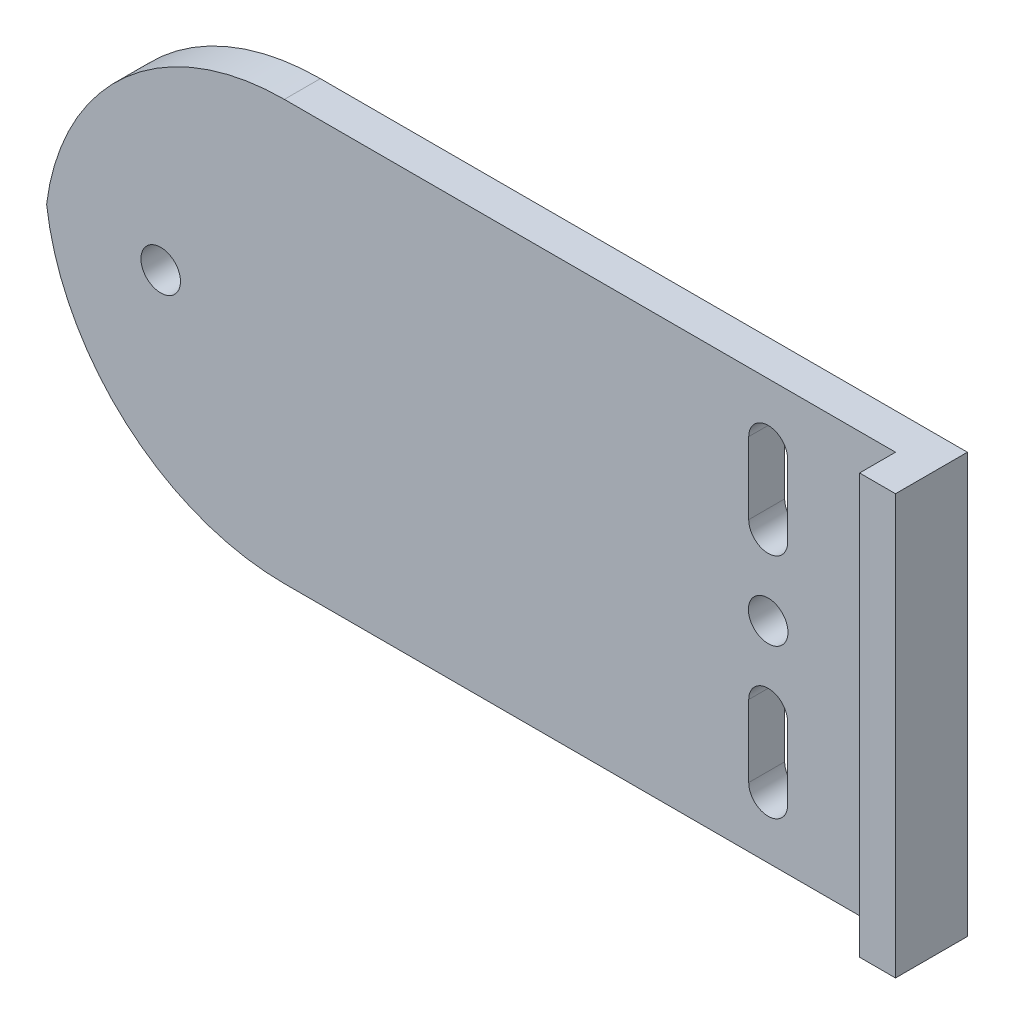
ISO-10303-21;
HEADER;
FILE_DESCRIPTION(('STEP AP214'),'2;1');
FILE_NAME('part.step','',(''),(''),'','','');
FILE_SCHEMA(('AUTOMOTIVE_DESIGN { 1 0 10303 214 1 1 1 1 }'));
ENDSEC;
DATA;
#1=APPLICATION_CONTEXT('core data for automotive mechanical design processes');
#2=APPLICATION_PROTOCOL_DEFINITION('international standard','automotive_design',2000,#1);
#3=PRODUCT_CONTEXT('',#1,'mechanical');
#4=PRODUCT('Part','Part','',(#3));
#5=PRODUCT_RELATED_PRODUCT_CATEGORY('part','',(#4));
#6=PRODUCT_DEFINITION_FORMATION('','',#4);
#7=PRODUCT_DEFINITION_CONTEXT('part definition',#1,'design');
#8=PRODUCT_DEFINITION('design','',#6,#7);
#9=PRODUCT_DEFINITION_SHAPE('','',#8);
#10=(LENGTH_UNIT() NAMED_UNIT(*) SI_UNIT(.MILLI.,.METRE.));
#11=(NAMED_UNIT(*) PLANE_ANGLE_UNIT() SI_UNIT($,.RADIAN.));
#12=(NAMED_UNIT(*) SI_UNIT($,.STERADIAN.) SOLID_ANGLE_UNIT());
#13=UNCERTAINTY_MEASURE_WITH_UNIT(LENGTH_MEASURE(1.E-05),#10,'distance_accuracy_value','');
#14=(GEOMETRIC_REPRESENTATION_CONTEXT(3) GLOBAL_UNCERTAINTY_ASSIGNED_CONTEXT((#13)) GLOBAL_UNIT_ASSIGNED_CONTEXT((#10,
#11,#12)) REPRESENTATION_CONTEXT('',''));
#15=CARTESIAN_POINT('',(0.,0.,0.));
#16=DIRECTION('',(0.,0.,1.));
#17=DIRECTION('',(1.,0.,0.));
#18=AXIS2_PLACEMENT_3D('',#15,#16,#17);
#19=CARTESIAN_POINT('',(0.,0.,3.));
#20=DIRECTION('',(0.,0.,1.));
#21=DIRECTION('',(1.,0.,0.));
#22=AXIS2_PLACEMENT_3D('',#19,#20,#21);
#23=PLANE('',#22);
#24=DIRECTION('',(0.,-1.,0.));
#25=VECTOR('',#24,1.);
#26=CARTESIAN_POINT('',(47.,0.,3.));
#27=LINE('',#26,#25);
#28=CARTESIAN_POINT('',(47.,17.5,3.));
#29=VERTEX_POINT('',#28);
#30=CARTESIAN_POINT('',(47.,-17.5,3.));
#31=VERTEX_POINT('',#30);
#32=EDGE_CURVE('E54',#29,#31,#27,.T.);
#33=ORIENTED_EDGE('',*,*,#32,.F.);
#34=DIRECTION('',(-1.,0.,0.));
#35=VECTOR('',#34,1.);
#36=CARTESIAN_POINT('',(0.,17.5,3.));
#37=LINE('',#36,#35);
#38=CARTESIAN_POINT('',(-4.,17.5,3.));
#39=VERTEX_POINT('',#38);
#40=EDGE_CURVE('E251',#29,#39,#37,.T.);
#41=ORIENTED_EDGE('',*,*,#40,.T.);
#42=CARTESIAN_POINT('',(-4.,-2.5,3.));
#43=DIRECTION('',(0.,0.,1.));
#44=DIRECTION('',(1.,0.,0.));
#45=AXIS2_PLACEMENT_3D('',#42,#43,#44);
#46=CIRCLE('',#45,20.);
#47=CARTESIAN_POINT('',(-23.8431348329844,0.,3.));
#48=VERTEX_POINT('',#47);
#49=EDGE_CURVE('E266',#39,#48,#46,.T.);
#50=ORIENTED_EDGE('',*,*,#49,.T.);
#51=CARTESIAN_POINT('',(-4.,2.5,3.));
#52=DIRECTION('',(0.,0.,1.));
#53=DIRECTION('',(1.,0.,0.));
#54=AXIS2_PLACEMENT_3D('',#51,#52,#53);
#55=CIRCLE('',#54,20.);
#56=CARTESIAN_POINT('',(-4.,-17.5,3.));
#57=VERTEX_POINT('',#56);
#58=EDGE_CURVE('E43',#48,#57,#55,.T.);
#59=ORIENTED_EDGE('',*,*,#58,.T.);
#60=DIRECTION('',(1.,0.,0.));
#61=VECTOR('',#60,1.);
#62=CARTESIAN_POINT('',(-24.,-17.5,3.));
#63=LINE('',#62,#61);
#64=EDGE_CURVE('E50',#57,#31,#63,.T.);
#65=ORIENTED_EDGE('',*,*,#64,.T.);
#66=EDGE_LOOP('',(#33,#41,#50,#59,#65));
#67=FACE_BOUND('',#66,.T.);
#68=CARTESIAN_POINT('',(36.375,0.,3.));
#69=DIRECTION('',(0.,0.,1.));
#70=DIRECTION('',(1.,0.,0.));
#71=AXIS2_PLACEMENT_3D('',#68,#69,#70);
#72=CIRCLE('',#71,1.65);
#73=CARTESIAN_POINT('',(38.025,0.,3.));
#74=VERTEX_POINT('',#73);
#75=EDGE_CURVE('E184',#74,#74,#72,.T.);
#76=ORIENTED_EDGE('',*,*,#75,.F.);
#77=EDGE_LOOP('',(#76));
#78=FACE_BOUND('',#77,.T.);
#79=DIRECTION('',(0.,-1.,0.));
#80=VECTOR('',#79,1.);
#81=CARTESIAN_POINT('',(34.75,12.5,3.));
#82=LINE('',#81,#80);
#83=CARTESIAN_POINT('',(34.75,12.5,3.));
#84=VERTEX_POINT('',#83);
#85=CARTESIAN_POINT('',(34.75,6.49999999999999,3.));
#86=VERTEX_POINT('',#85);
#87=EDGE_CURVE('E223',#84,#86,#82,.T.);
#88=ORIENTED_EDGE('',*,*,#87,.F.);
#89=CARTESIAN_POINT('',(36.375,12.5,3.));
#90=DIRECTION('',(0.,0.,1.));
#91=DIRECTION('',(1.,0.,0.));
#92=AXIS2_PLACEMENT_3D('',#89,#90,#91);
#93=CIRCLE('',#92,1.625);
#94=CARTESIAN_POINT('',(38.,12.5,3.));
#95=VERTEX_POINT('',#94);
#96=EDGE_CURVE('E221',#95,#84,#93,.T.);
#97=ORIENTED_EDGE('',*,*,#96,.F.);
#98=DIRECTION('',(0.,1.,0.));
#99=VECTOR('',#98,1.);
#100=CARTESIAN_POINT('',(38.,6.49999999999999,3.));
#101=LINE('',#100,#99);
#102=CARTESIAN_POINT('',(38.,6.49999999999999,3.));
#103=VERTEX_POINT('',#102);
#104=EDGE_CURVE('E229',#103,#95,#101,.T.);
#105=ORIENTED_EDGE('',*,*,#104,.F.);
#106=CARTESIAN_POINT('',(36.375,6.49999999999999,3.));
#107=DIRECTION('',(0.,0.,1.));
#108=DIRECTION('',(1.,0.,0.));
#109=AXIS2_PLACEMENT_3D('',#106,#107,#108);
#110=CIRCLE('',#109,1.625);
#111=EDGE_CURVE('E226',#86,#103,#110,.T.);
#112=ORIENTED_EDGE('',*,*,#111,.F.);
#113=EDGE_LOOP('',(#88,#97,#105,#112));
#114=FACE_BOUND('',#113,.T.);
#115=DIRECTION('',(0.,-1.,0.));
#116=VECTOR('',#115,1.);
#117=CARTESIAN_POINT('',(34.75,-6.5,3.));
#118=LINE('',#117,#116);
#119=CARTESIAN_POINT('',(34.75,-6.5,3.));
#120=VERTEX_POINT('',#119);
#121=CARTESIAN_POINT('',(34.75,-12.5,3.));
#122=VERTEX_POINT('',#121);
#123=EDGE_CURVE('E192',#120,#122,#118,.T.);
#124=ORIENTED_EDGE('',*,*,#123,.F.);
#125=CARTESIAN_POINT('',(36.375,-6.5,3.));
#126=DIRECTION('',(0.,0.,1.));
#127=DIRECTION('',(1.,0.,0.));
#128=AXIS2_PLACEMENT_3D('',#125,#126,#127);
#129=CIRCLE('',#128,1.62499999999999);
#130=CARTESIAN_POINT('',(38.,-6.5,3.));
#131=VERTEX_POINT('',#130);
#132=EDGE_CURVE('E190',#131,#120,#129,.T.);
#133=ORIENTED_EDGE('',*,*,#132,.F.);
#134=DIRECTION('',(0.,1.,0.));
#135=VECTOR('',#134,1.);
#136=CARTESIAN_POINT('',(38.,-12.5,3.));
#137=LINE('',#136,#135);
#138=CARTESIAN_POINT('',(38.,-12.5,3.));
#139=VERTEX_POINT('',#138);
#140=EDGE_CURVE('E198',#139,#131,#137,.T.);
#141=ORIENTED_EDGE('',*,*,#140,.F.);
#142=CARTESIAN_POINT('',(36.375,-12.5,3.));
#143=DIRECTION('',(0.,0.,1.));
#144=DIRECTION('',(1.,0.,0.));
#145=AXIS2_PLACEMENT_3D('',#142,#143,#144);
#146=CIRCLE('',#145,1.62499999999999);
#147=EDGE_CURVE('E195',#122,#139,#146,.T.);
#148=ORIENTED_EDGE('',*,*,#147,.F.);
#149=EDGE_LOOP('',(#124,#133,#141,#148));
#150=FACE_BOUND('',#149,.T.);
#151=CARTESIAN_POINT('',(-14.32,0.,3.));
#152=DIRECTION('',(0.,0.,1.));
#153=DIRECTION('',(1.,0.,0.));
#154=AXIS2_PLACEMENT_3D('',#151,#152,#153);
#155=CIRCLE('',#154,1.65);
#156=CARTESIAN_POINT('',(-12.67,0.,3.));
#157=VERTEX_POINT('',#156);
#158=EDGE_CURVE('E177',#157,#157,#155,.T.);
#159=ORIENTED_EDGE('',*,*,#158,.F.);
#160=EDGE_LOOP('',(#159));
#161=FACE_BOUND('',#160,.T.);
#162=ADVANCED_FACE('F34',(#67,#78,#114,#150,#161),#23,.T.);
#163=CARTESIAN_POINT('',(0.,0.,0.));
#164=DIRECTION('',(0.,0.,1.));
#165=DIRECTION('',(1.,0.,0.));
#166=AXIS2_PLACEMENT_3D('',#163,#164,#165);
#167=PLANE('',#166);
#168=CARTESIAN_POINT('',(36.375,12.5,0.));
#169=DIRECTION('',(0.,0.,1.));
#170=DIRECTION('',(1.,0.,0.));
#171=AXIS2_PLACEMENT_3D('',#168,#169,#170);
#172=CIRCLE('',#171,1.625);
#173=CARTESIAN_POINT('',(38.,12.5,0.));
#174=VERTEX_POINT('',#173);
#175=CARTESIAN_POINT('',(34.75,12.5,0.));
#176=VERTEX_POINT('',#175);
#177=EDGE_CURVE('E220',#174,#176,#172,.T.);
#178=ORIENTED_EDGE('',*,*,#177,.T.);
#179=DIRECTION('',(0.,-1.,0.));
#180=VECTOR('',#179,1.);
#181=CARTESIAN_POINT('',(34.75,12.5,0.));
#182=LINE('',#181,#180);
#183=CARTESIAN_POINT('',(34.75,6.49999999999999,0.));
#184=VERTEX_POINT('',#183);
#185=EDGE_CURVE('E234',#176,#184,#182,.T.);
#186=ORIENTED_EDGE('',*,*,#185,.T.);
#187=CARTESIAN_POINT('',(36.375,6.49999999999999,0.));
#188=DIRECTION('',(0.,0.,1.));
#189=DIRECTION('',(1.,0.,0.));
#190=AXIS2_PLACEMENT_3D('',#187,#188,#189);
#191=CIRCLE('',#190,1.625);
#192=CARTESIAN_POINT('',(38.,6.49999999999999,0.));
#193=VERTEX_POINT('',#192);
#194=EDGE_CURVE('E237',#184,#193,#191,.T.);
#195=ORIENTED_EDGE('',*,*,#194,.T.);
#196=DIRECTION('',(0.,1.,0.));
#197=VECTOR('',#196,1.);
#198=CARTESIAN_POINT('',(38.,6.49999999999999,0.));
#199=LINE('',#198,#197);
#200=EDGE_CURVE('E224',#193,#174,#199,.T.);
#201=ORIENTED_EDGE('',*,*,#200,.T.);
#202=EDGE_LOOP('',(#178,#186,#195,#201));
#203=FACE_BOUND('',#202,.T.);
#204=CARTESIAN_POINT('',(-4.,-2.5,0.));
#205=DIRECTION('',(0.,0.,1.));
#206=DIRECTION('',(1.,0.,0.));
#207=AXIS2_PLACEMENT_3D('',#204,#205,#206);
#208=CIRCLE('',#207,20.);
#209=CARTESIAN_POINT('',(-23.8431348329844,0.,0.));
#210=VERTEX_POINT('',#209);
#211=CARTESIAN_POINT('',(-4.,17.5,0.));
#212=VERTEX_POINT('',#211);
#213=EDGE_CURVE('E261',#210,#212,#208,.F.);
#214=ORIENTED_EDGE('',*,*,#213,.T.);
#215=DIRECTION('',(-1.,0.,0.));
#216=VECTOR('',#215,1.);
#217=CARTESIAN_POINT('',(0.,17.5,0.));
#218=LINE('',#217,#216);
#219=CARTESIAN_POINT('',(50.,17.5,0.));
#220=VERTEX_POINT('',#219);
#221=EDGE_CURVE('E253',#220,#212,#218,.T.);
#222=ORIENTED_EDGE('',*,*,#221,.F.);
#223=DIRECTION('',(0.,1.,0.));
#224=VECTOR('',#223,1.);
#225=CARTESIAN_POINT('',(50.,17.5,0.));
#226=LINE('',#225,#224);
#227=CARTESIAN_POINT('',(50.,-17.5,0.));
#228=VERTEX_POINT('',#227);
#229=EDGE_CURVE('E256',#228,#220,#226,.T.);
#230=ORIENTED_EDGE('',*,*,#229,.F.);
#231=DIRECTION('',(1.,0.,0.));
#232=VECTOR('',#231,1.);
#233=CARTESIAN_POINT('',(50.,-17.5,0.));
#234=LINE('',#233,#232);
#235=CARTESIAN_POINT('',(-4.,-17.5,0.));
#236=VERTEX_POINT('',#235);
#237=EDGE_CURVE('E147',#236,#228,#234,.T.);
#238=ORIENTED_EDGE('',*,*,#237,.F.);
#239=CARTESIAN_POINT('',(-4.,2.5,0.));
#240=DIRECTION('',(0.,0.,1.));
#241=DIRECTION('',(1.,0.,0.));
#242=AXIS2_PLACEMENT_3D('',#239,#240,#241);
#243=CIRCLE('',#242,20.);
#244=EDGE_CURVE('E264',#236,#210,#243,.F.);
#245=ORIENTED_EDGE('',*,*,#244,.T.);
#246=EDGE_LOOP('',(#214,#222,#230,#238,#245));
#247=FACE_BOUND('',#246,.T.);
#248=CARTESIAN_POINT('',(36.375,-6.5,0.));
#249=DIRECTION('',(0.,0.,1.));
#250=DIRECTION('',(1.,0.,0.));
#251=AXIS2_PLACEMENT_3D('',#248,#249,#250);
#252=CIRCLE('',#251,1.62499999999999);
#253=CARTESIAN_POINT('',(38.,-6.5,0.));
#254=VERTEX_POINT('',#253);
#255=CARTESIAN_POINT('',(34.75,-6.5,0.));
#256=VERTEX_POINT('',#255);
#257=EDGE_CURVE('E187',#254,#256,#252,.T.);
#258=ORIENTED_EDGE('',*,*,#257,.T.);
#259=DIRECTION('',(0.,-1.,0.));
#260=VECTOR('',#259,1.);
#261=CARTESIAN_POINT('',(34.75,-6.5,0.));
#262=LINE('',#261,#260);
#263=CARTESIAN_POINT('',(34.75,-12.5,0.));
#264=VERTEX_POINT('',#263);
#265=EDGE_CURVE('E203',#256,#264,#262,.T.);
#266=ORIENTED_EDGE('',*,*,#265,.T.);
#267=CARTESIAN_POINT('',(36.375,-12.5,0.));
#268=DIRECTION('',(0.,0.,1.));
#269=DIRECTION('',(1.,0.,0.));
#270=AXIS2_PLACEMENT_3D('',#267,#268,#269);
#271=CIRCLE('',#270,1.62499999999999);
#272=CARTESIAN_POINT('',(38.,-12.5,0.));
#273=VERTEX_POINT('',#272);
#274=EDGE_CURVE('E206',#264,#273,#271,.T.);
#275=ORIENTED_EDGE('',*,*,#274,.T.);
#276=DIRECTION('',(0.,1.,0.));
#277=VECTOR('',#276,1.);
#278=CARTESIAN_POINT('',(38.,-12.5,0.));
#279=LINE('',#278,#277);
#280=EDGE_CURVE('E193',#273,#254,#279,.T.);
#281=ORIENTED_EDGE('',*,*,#280,.T.);
#282=EDGE_LOOP('',(#258,#266,#275,#281));
#283=FACE_BOUND('',#282,.T.);
#284=CARTESIAN_POINT('',(36.375,0.,0.));
#285=DIRECTION('',(0.,0.,1.));
#286=DIRECTION('',(1.,0.,0.));
#287=AXIS2_PLACEMENT_3D('',#284,#285,#286);
#288=CIRCLE('',#287,1.65);
#289=CARTESIAN_POINT('',(38.025,0.,0.));
#290=VERTEX_POINT('',#289);
#291=EDGE_CURVE('E180',#290,#290,#288,.T.);
#292=ORIENTED_EDGE('',*,*,#291,.T.);
#293=EDGE_LOOP('',(#292));
#294=FACE_BOUND('',#293,.T.);
#295=CARTESIAN_POINT('',(-14.32,0.,0.));
#296=DIRECTION('',(0.,0.,1.));
#297=DIRECTION('',(1.,0.,0.));
#298=AXIS2_PLACEMENT_3D('',#295,#296,#297);
#299=CIRCLE('',#298,1.65);
#300=CARTESIAN_POINT('',(-12.67,0.,0.));
#301=VERTEX_POINT('',#300);
#302=EDGE_CURVE('E181',#301,#301,#299,.T.);
#303=ORIENTED_EDGE('',*,*,#302,.T.);
#304=EDGE_LOOP('',(#303));
#305=FACE_BOUND('',#304,.T.);
#306=ADVANCED_FACE('F278',(#203,#247,#283,#294,#305),#167,.F.);
#307=CARTESIAN_POINT('',(50.,-17.5,3.));
#308=DIRECTION('',(0.,1.,0.));
#309=DIRECTION('',(-1.,0.,0.));
#310=AXIS2_PLACEMENT_3D('',#307,#308,#309);
#311=PLANE('',#310);
#312=ORIENTED_EDGE('',*,*,#237,.T.);
#313=DIRECTION('',(0.,0.,-1.));
#314=VECTOR('',#313,1.);
#315=CARTESIAN_POINT('',(50.,-17.5,3.));
#316=LINE('',#315,#314);
#317=CARTESIAN_POINT('',(50.,-17.5,6.));
#318=VERTEX_POINT('',#317);
#319=EDGE_CURVE('E140',#318,#228,#316,.T.);
#320=ORIENTED_EDGE('',*,*,#319,.F.);
#321=DIRECTION('',(-1.,0.,0.));
#322=VECTOR('',#321,1.);
#323=CARTESIAN_POINT('',(50.,-17.5,6.));
#324=LINE('',#323,#322);
#325=CARTESIAN_POINT('',(47.,-17.5,6.));
#326=VERTEX_POINT('',#325);
#327=EDGE_CURVE('E144',#318,#326,#324,.T.);
#328=ORIENTED_EDGE('',*,*,#327,.T.);
#329=DIRECTION('',(0.,0.,-1.));
#330=VECTOR('',#329,1.);
#331=CARTESIAN_POINT('',(47.,-17.5,6.));
#332=LINE('',#331,#330);
#333=EDGE_CURVE('E171',#326,#31,#332,.T.);
#334=ORIENTED_EDGE('',*,*,#333,.T.);
#335=ORIENTED_EDGE('',*,*,#64,.F.);
#336=DIRECTION('',(0.,0.,-1.));
#337=VECTOR('',#336,1.);
#338=CARTESIAN_POINT('',(-4.,-17.5,3.));
#339=LINE('',#338,#337);
#340=EDGE_CURVE('E151',#57,#236,#339,.T.);
#341=ORIENTED_EDGE('',*,*,#340,.T.);
#342=EDGE_LOOP('',(#312,#320,#328,#334,#335,#341));
#343=FACE_BOUND('',#342,.T.);
#344=ADVANCED_FACE('F142',(#343),#311,.F.);
#345=CARTESIAN_POINT('',(50.,17.5,3.));
#346=DIRECTION('',(-1.,0.,0.));
#347=DIRECTION('',(0.,0.,1.));
#348=AXIS2_PLACEMENT_3D('',#345,#346,#347);
#349=PLANE('',#348);
#350=ORIENTED_EDGE('',*,*,#229,.T.);
#351=DIRECTION('',(0.,0.,-1.));
#352=VECTOR('',#351,1.);
#353=CARTESIAN_POINT('',(50.,17.5,3.));
#354=LINE('',#353,#352);
#355=CARTESIAN_POINT('',(50.,17.5,6.));
#356=VERTEX_POINT('',#355);
#357=EDGE_CURVE('E152',#356,#220,#354,.T.);
#358=ORIENTED_EDGE('',*,*,#357,.F.);
#359=DIRECTION('',(0.,-1.,0.));
#360=VECTOR('',#359,1.);
#361=CARTESIAN_POINT('',(50.,-17.5,6.));
#362=LINE('',#361,#360);
#363=EDGE_CURVE('E159',#356,#318,#362,.T.);
#364=ORIENTED_EDGE('',*,*,#363,.T.);
#365=ORIENTED_EDGE('',*,*,#319,.T.);
#366=EDGE_LOOP('',(#350,#358,#364,#365));
#367=FACE_BOUND('',#366,.T.);
#368=ADVANCED_FACE('F164',(#367),#349,.F.);
#369=CARTESIAN_POINT('',(0.,17.5,3.));
#370=DIRECTION('',(0.,-1.,0.));
#371=DIRECTION('',(1.,0.,0.));
#372=AXIS2_PLACEMENT_3D('',#369,#370,#371);
#373=PLANE('',#372);
#374=ORIENTED_EDGE('',*,*,#40,.F.);
#375=DIRECTION('',(0.,0.,-1.));
#376=VECTOR('',#375,1.);
#377=CARTESIAN_POINT('',(47.,17.5,6.));
#378=LINE('',#377,#376);
#379=CARTESIAN_POINT('',(47.,17.5,6.));
#380=VERTEX_POINT('',#379);
#381=EDGE_CURVE('E172',#380,#29,#378,.T.);
#382=ORIENTED_EDGE('',*,*,#381,.F.);
#383=DIRECTION('',(1.,0.,0.));
#384=VECTOR('',#383,1.);
#385=CARTESIAN_POINT('',(50.,17.5,6.));
#386=LINE('',#385,#384);
#387=EDGE_CURVE('E169',#380,#356,#386,.T.);
#388=ORIENTED_EDGE('',*,*,#387,.T.);
#389=ORIENTED_EDGE('',*,*,#357,.T.);
#390=ORIENTED_EDGE('',*,*,#221,.T.);
#391=DIRECTION('',(0.,0.,-1.));
#392=VECTOR('',#391,1.);
#393=CARTESIAN_POINT('',(-4.,17.5,3.));
#394=LINE('',#393,#392);
#395=EDGE_CURVE('E11',#212,#39,#394,.F.);
#396=ORIENTED_EDGE('',*,*,#395,.T.);
#397=EDGE_LOOP('',(#374,#382,#388,#389,#390,#396));
#398=FACE_BOUND('',#397,.T.);
#399=ADVANCED_FACE('F284',(#398),#373,.F.);
#400=CARTESIAN_POINT('',(36.375,12.5,3.));
#401=DIRECTION('',(0.,0.,-1.));
#402=DIRECTION('',(-1.,0.,0.));
#403=AXIS2_PLACEMENT_3D('',#400,#401,#402);
#404=CYLINDRICAL_SURFACE('',#403,1.625);
#405=ORIENTED_EDGE('',*,*,#177,.F.);
#406=DIRECTION('',(0.,0.,-1.));
#407=VECTOR('',#406,1.);
#408=CARTESIAN_POINT('',(38.,12.5,3.));
#409=LINE('',#408,#407);
#410=EDGE_CURVE('E231',#95,#174,#409,.T.);
#411=ORIENTED_EDGE('',*,*,#410,.F.);
#412=ORIENTED_EDGE('',*,*,#96,.T.);
#413=DIRECTION('',(0.,0.,-1.));
#414=VECTOR('',#413,1.);
#415=CARTESIAN_POINT('',(34.75,12.5,3.));
#416=LINE('',#415,#414);
#417=EDGE_CURVE('E248',#84,#176,#416,.T.);
#418=ORIENTED_EDGE('',*,*,#417,.T.);
#419=EDGE_LOOP('',(#405,#411,#412,#418));
#420=FACE_BOUND('',#419,.T.);
#421=ADVANCED_FACE('F303',(#420),#404,.F.);
#422=CARTESIAN_POINT('',(34.75,12.5,3.));
#423=DIRECTION('',(1.,0.,0.));
#424=DIRECTION('',(0.,1.,0.));
#425=AXIS2_PLACEMENT_3D('',#422,#423,#424);
#426=PLANE('',#425);
#427=ORIENTED_EDGE('',*,*,#185,.F.);
#428=ORIENTED_EDGE('',*,*,#417,.F.);
#429=ORIENTED_EDGE('',*,*,#87,.T.);
#430=DIRECTION('',(0.,0.,-1.));
#431=VECTOR('',#430,1.);
#432=CARTESIAN_POINT('',(34.75,6.49999999999999,3.));
#433=LINE('',#432,#431);
#434=EDGE_CURVE('E246',#86,#184,#433,.T.);
#435=ORIENTED_EDGE('',*,*,#434,.T.);
#436=EDGE_LOOP('',(#427,#428,#429,#435));
#437=FACE_BOUND('',#436,.T.);
#438=ADVANCED_FACE('F329',(#437),#426,.T.);
#439=CARTESIAN_POINT('',(36.375,6.49999999999999,3.));
#440=DIRECTION('',(0.,0.,-1.));
#441=DIRECTION('',(-1.,0.,0.));
#442=AXIS2_PLACEMENT_3D('',#439,#440,#441);
#443=CYLINDRICAL_SURFACE('',#442,1.625);
#444=ORIENTED_EDGE('',*,*,#194,.F.);
#445=ORIENTED_EDGE('',*,*,#434,.F.);
#446=ORIENTED_EDGE('',*,*,#111,.T.);
#447=DIRECTION('',(0.,0.,-1.));
#448=VECTOR('',#447,1.);
#449=CARTESIAN_POINT('',(38.,6.49999999999999,3.));
#450=LINE('',#449,#448);
#451=EDGE_CURVE('E244',#103,#193,#450,.T.);
#452=ORIENTED_EDGE('',*,*,#451,.T.);
#453=EDGE_LOOP('',(#444,#445,#446,#452));
#454=FACE_BOUND('',#453,.T.);
#455=ADVANCED_FACE('F336',(#454),#443,.F.);
#456=CARTESIAN_POINT('',(38.,6.49999999999999,3.));
#457=DIRECTION('',(-1.,0.,0.));
#458=DIRECTION('',(0.,0.,1.));
#459=AXIS2_PLACEMENT_3D('',#456,#457,#458);
#460=PLANE('',#459);
#461=ORIENTED_EDGE('',*,*,#200,.F.);
#462=ORIENTED_EDGE('',*,*,#451,.F.);
#463=ORIENTED_EDGE('',*,*,#104,.T.);
#464=ORIENTED_EDGE('',*,*,#410,.T.);
#465=EDGE_LOOP('',(#461,#462,#463,#464));
#466=FACE_BOUND('',#465,.T.);
#467=ADVANCED_FACE('F343',(#466),#460,.T.);
#468=CARTESIAN_POINT('',(36.375,-6.5,3.));
#469=DIRECTION('',(0.,0.,-1.));
#470=DIRECTION('',(-1.,0.,0.));
#471=AXIS2_PLACEMENT_3D('',#468,#469,#470);
#472=CYLINDRICAL_SURFACE('',#471,1.62499999999999);
#473=ORIENTED_EDGE('',*,*,#257,.F.);
#474=DIRECTION('',(0.,0.,-1.));
#475=VECTOR('',#474,1.);
#476=CARTESIAN_POINT('',(38.,-6.5,3.));
#477=LINE('',#476,#475);
#478=EDGE_CURVE('E200',#131,#254,#477,.T.);
#479=ORIENTED_EDGE('',*,*,#478,.F.);
#480=ORIENTED_EDGE('',*,*,#132,.T.);
#481=DIRECTION('',(0.,0.,-1.));
#482=VECTOR('',#481,1.);
#483=CARTESIAN_POINT('',(34.75,-6.5,3.));
#484=LINE('',#483,#482);
#485=EDGE_CURVE('E217',#120,#256,#484,.T.);
#486=ORIENTED_EDGE('',*,*,#485,.T.);
#487=EDGE_LOOP('',(#473,#479,#480,#486));
#488=FACE_BOUND('',#487,.T.);
#489=ADVANCED_FACE('F351',(#488),#472,.F.);
#490=CARTESIAN_POINT('',(34.75,-6.5,3.));
#491=DIRECTION('',(1.,0.,0.));
#492=DIRECTION('',(0.,0.,-1.));
#493=AXIS2_PLACEMENT_3D('',#490,#491,#492);
#494=PLANE('',#493);
#495=ORIENTED_EDGE('',*,*,#265,.F.);
#496=ORIENTED_EDGE('',*,*,#485,.F.);
#497=ORIENTED_EDGE('',*,*,#123,.T.);
#498=DIRECTION('',(0.,0.,-1.));
#499=VECTOR('',#498,1.);
#500=CARTESIAN_POINT('',(34.75,-12.5,3.));
#501=LINE('',#500,#499);
#502=EDGE_CURVE('E215',#122,#264,#501,.T.);
#503=ORIENTED_EDGE('',*,*,#502,.T.);
#504=EDGE_LOOP('',(#495,#496,#497,#503));
#505=FACE_BOUND('',#504,.T.);
#506=ADVANCED_FACE('F359',(#505),#494,.T.);
#507=CARTESIAN_POINT('',(36.375,-12.5,3.));
#508=DIRECTION('',(0.,0.,-1.));
#509=DIRECTION('',(-1.,0.,0.));
#510=AXIS2_PLACEMENT_3D('',#507,#508,#509);
#511=CYLINDRICAL_SURFACE('',#510,1.62499999999999);
#512=ORIENTED_EDGE('',*,*,#274,.F.);
#513=ORIENTED_EDGE('',*,*,#502,.F.);
#514=ORIENTED_EDGE('',*,*,#147,.T.);
#515=DIRECTION('',(0.,0.,-1.));
#516=VECTOR('',#515,1.);
#517=CARTESIAN_POINT('',(38.,-12.5,3.));
#518=LINE('',#517,#516);
#519=EDGE_CURVE('E213',#139,#273,#518,.T.);
#520=ORIENTED_EDGE('',*,*,#519,.T.);
#521=EDGE_LOOP('',(#512,#513,#514,#520));
#522=FACE_BOUND('',#521,.T.);
#523=ADVANCED_FACE('F367',(#522),#511,.F.);
#524=CARTESIAN_POINT('',(38.,-12.5,3.));
#525=DIRECTION('',(-1.,0.,0.));
#526=DIRECTION('',(0.,0.,1.));
#527=AXIS2_PLACEMENT_3D('',#524,#525,#526);
#528=PLANE('',#527);
#529=ORIENTED_EDGE('',*,*,#280,.F.);
#530=ORIENTED_EDGE('',*,*,#519,.F.);
#531=ORIENTED_EDGE('',*,*,#140,.T.);
#532=ORIENTED_EDGE('',*,*,#478,.T.);
#533=EDGE_LOOP('',(#529,#530,#531,#532));
#534=FACE_BOUND('',#533,.T.);
#535=ADVANCED_FACE('F375',(#534),#528,.T.);
#536=CARTESIAN_POINT('',(36.375,0.,3.));
#537=DIRECTION('',(0.,0.,-1.));
#538=DIRECTION('',(-1.,0.,0.));
#539=AXIS2_PLACEMENT_3D('',#536,#537,#538);
#540=CYLINDRICAL_SURFACE('',#539,1.65);
#541=ORIENTED_EDGE('',*,*,#75,.T.);
#542=EDGE_LOOP('',(#541));
#543=FACE_BOUND('',#542,.T.);
#544=ORIENTED_EDGE('',*,*,#291,.F.);
#545=EDGE_LOOP('',(#544));
#546=FACE_BOUND('',#545,.T.);
#547=ADVANCED_FACE('F383',(#543,#546),#540,.F.);
#548=CARTESIAN_POINT('',(-14.32,0.,3.));
#549=DIRECTION('',(0.,0.,-1.));
#550=DIRECTION('',(-1.,0.,0.));
#551=AXIS2_PLACEMENT_3D('',#548,#549,#550);
#552=CYLINDRICAL_SURFACE('',#551,1.65);
#553=ORIENTED_EDGE('',*,*,#158,.T.);
#554=EDGE_LOOP('',(#553));
#555=FACE_BOUND('',#554,.T.);
#556=ORIENTED_EDGE('',*,*,#302,.F.);
#557=EDGE_LOOP('',(#556));
#558=FACE_BOUND('',#557,.T.);
#559=ADVANCED_FACE('F391',(#555,#558),#552,.F.);
#560=CARTESIAN_POINT('',(-4.,-2.5,3.));
#561=DIRECTION('',(0.,0.,-1.));
#562=DIRECTION('',(-1.,0.,0.));
#563=AXIS2_PLACEMENT_3D('',#560,#561,#562);
#564=CYLINDRICAL_SURFACE('',#563,20.);
#565=DIRECTION('',(0.,0.,-1.));
#566=VECTOR('',#565,1.);
#567=CARTESIAN_POINT('',(-23.8431348329844,0.,1.5));
#568=LINE('',#567,#566);
#569=EDGE_CURVE('E38',#48,#210,#568,.T.);
#570=ORIENTED_EDGE('',*,*,#569,.F.);
#571=ORIENTED_EDGE('',*,*,#49,.F.);
#572=ORIENTED_EDGE('',*,*,#395,.F.);
#573=ORIENTED_EDGE('',*,*,#213,.F.);
#574=EDGE_LOOP('',(#570,#571,#572,#573));
#575=FACE_BOUND('',#574,.T.);
#576=ADVANCED_FACE('F36',(#575),#564,.T.);
#577=CARTESIAN_POINT('',(-4.,2.5,3.));
#578=DIRECTION('',(0.,0.,-1.));
#579=DIRECTION('',(-1.,0.,0.));
#580=AXIS2_PLACEMENT_3D('',#577,#578,#579);
#581=CYLINDRICAL_SURFACE('',#580,20.);
#582=ORIENTED_EDGE('',*,*,#58,.F.);
#583=ORIENTED_EDGE('',*,*,#569,.T.);
#584=ORIENTED_EDGE('',*,*,#244,.F.);
#585=ORIENTED_EDGE('',*,*,#340,.F.);
#586=EDGE_LOOP('',(#582,#583,#584,#585));
#587=FACE_BOUND('',#586,.T.);
#588=ADVANCED_FACE('F275',(#587),#581,.T.);
#589=CARTESIAN_POINT('',(47.,-17.5,6.));
#590=DIRECTION('',(-1.,0.,0.));
#591=DIRECTION('',(0.,0.,1.));
#592=AXIS2_PLACEMENT_3D('',#589,#590,#591);
#593=PLANE('',#592);
#594=ORIENTED_EDGE('',*,*,#381,.T.);
#595=ORIENTED_EDGE('',*,*,#32,.T.);
#596=ORIENTED_EDGE('',*,*,#333,.F.);
#597=DIRECTION('',(0.,1.,0.));
#598=VECTOR('',#597,1.);
#599=CARTESIAN_POINT('',(47.,-17.5,6.));
#600=LINE('',#599,#598);
#601=EDGE_CURVE('E162',#326,#380,#600,.T.);
#602=ORIENTED_EDGE('',*,*,#601,.T.);
#603=EDGE_LOOP('',(#594,#595,#596,#602));
#604=FACE_BOUND('',#603,.T.);
#605=ADVANCED_FACE('F286',(#604),#593,.T.);
#606=CARTESIAN_POINT('',(0.,0.,6.));
#607=DIRECTION('',(0.,0.,1.));
#608=DIRECTION('',(1.,0.,0.));
#609=AXIS2_PLACEMENT_3D('',#606,#607,#608);
#610=PLANE('',#609);
#611=ORIENTED_EDGE('',*,*,#363,.F.);
#612=ORIENTED_EDGE('',*,*,#387,.F.);
#613=ORIENTED_EDGE('',*,*,#601,.F.);
#614=ORIENTED_EDGE('',*,*,#327,.F.);
#615=EDGE_LOOP('',(#611,#612,#613,#614));
#616=FACE_BOUND('',#615,.T.);
#617=ADVANCED_FACE('F157',(#616),#610,.T.);
#618=CLOSED_SHELL('',(#162,#306,#344,#368,#399,#421,#438,#455,#467,#489,#506,#523,#535,#547,
#559,#576,#588,#605,#617));
#619=MANIFOLD_SOLID_BREP('B2',#618);
#620=ADVANCED_BREP_SHAPE_REPRESENTATION('',(#18,#619),#14);
#621=SHAPE_DEFINITION_REPRESENTATION(#9,#620);
ENDSEC;
END-ISO-10303-21;
